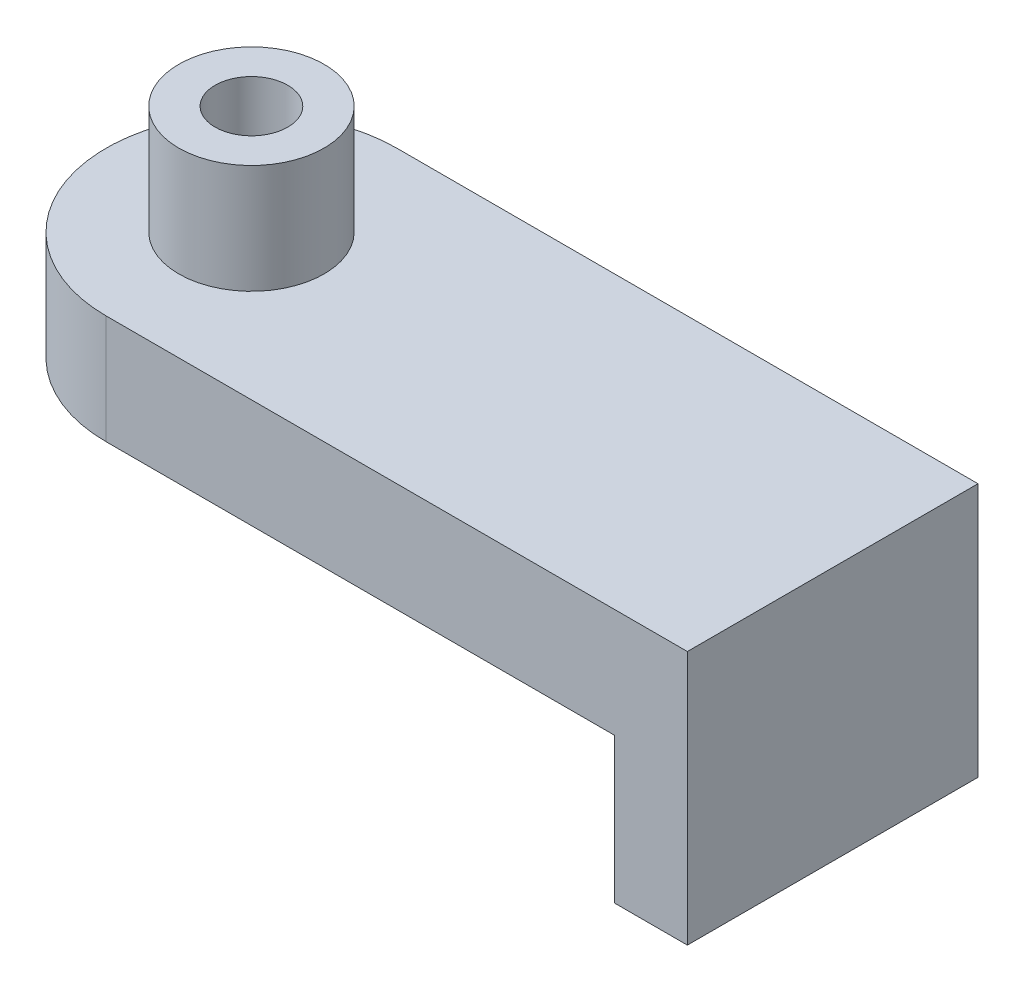
ISO-10303-21;
HEADER;
FILE_DESCRIPTION(('STEP AP214'),'2;1');
FILE_NAME('part.step','',(''),(''),'','','');
FILE_SCHEMA(('AUTOMOTIVE_DESIGN { 1 0 10303 214 1 1 1 1 }'));
ENDSEC;
DATA;
#1=APPLICATION_CONTEXT('core data for automotive mechanical design processes');
#2=APPLICATION_PROTOCOL_DEFINITION('international standard','automotive_design',2000,#1);
#3=PRODUCT_CONTEXT('',#1,'mechanical');
#4=PRODUCT('Part','Part','',(#3));
#5=PRODUCT_RELATED_PRODUCT_CATEGORY('part','',(#4));
#6=PRODUCT_DEFINITION_FORMATION('','',#4);
#7=PRODUCT_DEFINITION_CONTEXT('part definition',#1,'design');
#8=PRODUCT_DEFINITION('design','',#6,#7);
#9=PRODUCT_DEFINITION_SHAPE('','',#8);
#10=(LENGTH_UNIT() NAMED_UNIT(*) SI_UNIT(.MILLI.,.METRE.));
#11=(NAMED_UNIT(*) PLANE_ANGLE_UNIT() SI_UNIT($,.RADIAN.));
#12=(NAMED_UNIT(*) SI_UNIT($,.STERADIAN.) SOLID_ANGLE_UNIT());
#13=UNCERTAINTY_MEASURE_WITH_UNIT(LENGTH_MEASURE(1.E-05),#10,'distance_accuracy_value','');
#14=(GEOMETRIC_REPRESENTATION_CONTEXT(3) GLOBAL_UNCERTAINTY_ASSIGNED_CONTEXT((#13)) GLOBAL_UNIT_ASSIGNED_CONTEXT((#10,
#11,#12)) REPRESENTATION_CONTEXT('',''));
#15=CARTESIAN_POINT('',(0.,0.,0.));
#16=DIRECTION('',(0.,0.,1.));
#17=DIRECTION('',(1.,0.,0.));
#18=AXIS2_PLACEMENT_3D('',#15,#16,#17);
#19=CARTESIAN_POINT('',(0.,0.,-20.));
#20=DIRECTION('',(0.,1.,0.));
#21=DIRECTION('',(0.,0.,1.));
#22=AXIS2_PLACEMENT_3D('',#19,#20,#21);
#23=PLANE('',#22);
#24=CARTESIAN_POINT('',(0.,0.,-20.));
#25=DIRECTION('',(0.,1.,0.));
#26=DIRECTION('',(0.,0.,1.));
#27=AXIS2_PLACEMENT_3D('',#24,#25,#26);
#28=CIRCLE('',#27,5.);
#29=CARTESIAN_POINT('',(0.,0.,-15.));
#30=VERTEX_POINT('',#29);
#31=EDGE_CURVE('E144',#30,#30,#28,.T.);
#32=ORIENTED_EDGE('',*,*,#31,.T.);
#33=EDGE_LOOP('',(#32));
#34=FACE_BOUND('',#33,.T.);
#35=DIRECTION('',(0.,0.,-1.));
#36=VECTOR('',#35,1.);
#37=CARTESIAN_POINT('',(70.,0.,0.));
#38=LINE('',#37,#36);
#39=CARTESIAN_POINT('',(70.,0.,0.));
#40=VERTEX_POINT('',#39);
#41=CARTESIAN_POINT('',(70.,0.,-40.));
#42=VERTEX_POINT('',#41);
#43=EDGE_CURVE('E49',#40,#42,#38,.T.);
#44=ORIENTED_EDGE('',*,*,#43,.F.);
#45=DIRECTION('',(1.,0.,0.));
#46=VECTOR('',#45,1.);
#47=CARTESIAN_POINT('',(0.,0.,0.));
#48=LINE('',#47,#46);
#49=CARTESIAN_POINT('',(0.,0.,0.));
#50=VERTEX_POINT('',#49);
#51=EDGE_CURVE('E128',#50,#40,#48,.T.);
#52=ORIENTED_EDGE('',*,*,#51,.F.);
#53=CARTESIAN_POINT('',(0.,0.,-20.));
#54=DIRECTION('',(0.,1.,0.));
#55=DIRECTION('',(0.,0.,1.));
#56=AXIS2_PLACEMENT_3D('',#53,#54,#55);
#57=CIRCLE('',#56,20.);
#58=CARTESIAN_POINT('',(0.,0.,-40.));
#59=VERTEX_POINT('',#58);
#60=EDGE_CURVE('E148',#59,#50,#57,.T.);
#61=ORIENTED_EDGE('',*,*,#60,.F.);
#62=DIRECTION('',(-1.,0.,0.));
#63=VECTOR('',#62,1.);
#64=CARTESIAN_POINT('',(0.,0.,-40.));
#65=LINE('',#64,#63);
#66=EDGE_CURVE('E71',#42,#59,#65,.T.);
#67=ORIENTED_EDGE('',*,*,#66,.F.);
#68=EDGE_LOOP('',(#44,#52,#61,#67));
#69=FACE_BOUND('',#68,.T.);
#70=ADVANCED_FACE('F32',(#34,#69),#23,.F.);
#71=CARTESIAN_POINT('',(0.,15.,-20.));
#72=DIRECTION('',(0.,1.,0.));
#73=DIRECTION('',(0.,0.,1.));
#74=AXIS2_PLACEMENT_3D('',#71,#72,#73);
#75=PLANE('',#74);
#76=CARTESIAN_POINT('',(0.,15.,-20.));
#77=DIRECTION('',(0.,1.,0.));
#78=DIRECTION('',(0.,0.,1.));
#79=AXIS2_PLACEMENT_3D('',#76,#77,#78);
#80=CIRCLE('',#79,20.);
#81=CARTESIAN_POINT('',(0.,15.,-40.));
#82=VERTEX_POINT('',#81);
#83=CARTESIAN_POINT('',(0.,15.,0.));
#84=VERTEX_POINT('',#83);
#85=EDGE_CURVE('E149',#82,#84,#80,.T.);
#86=ORIENTED_EDGE('',*,*,#85,.T.);
#87=DIRECTION('',(1.,0.,0.));
#88=VECTOR('',#87,1.);
#89=CARTESIAN_POINT('',(0.,15.,0.));
#90=LINE('',#89,#88);
#91=CARTESIAN_POINT('',(80.,15.,0.));
#92=VERTEX_POINT('',#91);
#93=EDGE_CURVE('E78',#84,#92,#90,.T.);
#94=ORIENTED_EDGE('',*,*,#93,.T.);
#95=DIRECTION('',(0.,0.,-1.));
#96=VECTOR('',#95,1.);
#97=CARTESIAN_POINT('',(80.,15.,0.));
#98=LINE('',#97,#96);
#99=CARTESIAN_POINT('',(80.,15.,-40.));
#100=VERTEX_POINT('',#99);
#101=EDGE_CURVE('E100',#92,#100,#98,.T.);
#102=ORIENTED_EDGE('',*,*,#101,.T.);
#103=DIRECTION('',(-1.,0.,0.));
#104=VECTOR('',#103,1.);
#105=CARTESIAN_POINT('',(0.,15.,-40.));
#106=LINE('',#105,#104);
#107=EDGE_CURVE('E58',#100,#82,#106,.T.);
#108=ORIENTED_EDGE('',*,*,#107,.T.);
#109=EDGE_LOOP('',(#86,#94,#102,#108));
#110=FACE_BOUND('',#109,.T.);
#111=CARTESIAN_POINT('',(0.,15.,-20.));
#112=DIRECTION('',(0.,1.,0.));
#113=DIRECTION('',(0.,0.,1.));
#114=AXIS2_PLACEMENT_3D('',#111,#112,#113);
#115=CIRCLE('',#114,10.);
#116=CARTESIAN_POINT('',(0.,15.,-10.));
#117=VERTEX_POINT('',#116);
#118=EDGE_CURVE('E135',#117,#117,#115,.T.);
#119=ORIENTED_EDGE('',*,*,#118,.F.);
#120=EDGE_LOOP('',(#119));
#121=FACE_BOUND('',#120,.T.);
#122=ADVANCED_FACE('F181',(#110,#121),#75,.T.);
#123=CARTESIAN_POINT('',(0.,15.,-20.));
#124=DIRECTION('',(0.,-1.,0.));
#125=DIRECTION('',(0.,0.,-1.));
#126=AXIS2_PLACEMENT_3D('',#123,#124,#125);
#127=CYLINDRICAL_SURFACE('',#126,20.);
#128=ORIENTED_EDGE('',*,*,#60,.T.);
#129=DIRECTION('',(0.,-1.,0.));
#130=VECTOR('',#129,1.);
#131=CARTESIAN_POINT('',(0.,15.,0.));
#132=LINE('',#131,#130);
#133=EDGE_CURVE('E11',#84,#50,#132,.T.);
#134=ORIENTED_EDGE('',*,*,#133,.F.);
#135=ORIENTED_EDGE('',*,*,#85,.F.);
#136=DIRECTION('',(0.,-1.,0.));
#137=VECTOR('',#136,1.);
#138=CARTESIAN_POINT('',(0.,15.,-40.));
#139=LINE('',#138,#137);
#140=EDGE_CURVE('E154',#82,#59,#139,.T.);
#141=ORIENTED_EDGE('',*,*,#140,.T.);
#142=EDGE_LOOP('',(#128,#134,#135,#141));
#143=FACE_BOUND('',#142,.T.);
#144=ADVANCED_FACE('F34',(#143),#127,.T.);
#145=CARTESIAN_POINT('',(0.,15.,0.));
#146=DIRECTION('',(0.,0.,-1.));
#147=DIRECTION('',(-1.,0.,0.));
#148=AXIS2_PLACEMENT_3D('',#145,#146,#147);
#149=PLANE('',#148);
#150=ORIENTED_EDGE('',*,*,#51,.T.);
#151=DIRECTION('',(0.,1.,0.));
#152=VECTOR('',#151,1.);
#153=CARTESIAN_POINT('',(70.,-20.,0.));
#154=LINE('',#153,#152);
#155=CARTESIAN_POINT('',(70.,-20.,0.));
#156=VERTEX_POINT('',#155);
#157=EDGE_CURVE('E107',#156,#40,#154,.T.);
#158=ORIENTED_EDGE('',*,*,#157,.F.);
#159=DIRECTION('',(-1.,0.,0.));
#160=VECTOR('',#159,1.);
#161=CARTESIAN_POINT('',(80.,-20.,0.));
#162=LINE('',#161,#160);
#163=CARTESIAN_POINT('',(80.,-20.,0.));
#164=VERTEX_POINT('',#163);
#165=EDGE_CURVE('E104',#164,#156,#162,.T.);
#166=ORIENTED_EDGE('',*,*,#165,.F.);
#167=DIRECTION('',(0.,-1.,0.));
#168=VECTOR('',#167,1.);
#169=CARTESIAN_POINT('',(80.,15.,0.));
#170=LINE('',#169,#168);
#171=EDGE_CURVE('E41',#92,#164,#170,.T.);
#172=ORIENTED_EDGE('',*,*,#171,.F.);
#173=ORIENTED_EDGE('',*,*,#93,.F.);
#174=ORIENTED_EDGE('',*,*,#133,.T.);
#175=EDGE_LOOP('',(#150,#158,#166,#172,#173,#174));
#176=FACE_BOUND('',#175,.T.);
#177=ADVANCED_FACE('F105',(#176),#149,.F.);
#178=CARTESIAN_POINT('',(80.,15.,0.));
#179=DIRECTION('',(-1.,0.,0.));
#180=DIRECTION('',(0.,0.,1.));
#181=AXIS2_PLACEMENT_3D('',#178,#179,#180);
#182=PLANE('',#181);
#183=ORIENTED_EDGE('',*,*,#171,.T.);
#184=DIRECTION('',(0.,0.,1.));
#185=VECTOR('',#184,1.);
#186=CARTESIAN_POINT('',(80.,-20.,0.));
#187=LINE('',#186,#185);
#188=CARTESIAN_POINT('',(80.,-20.,-40.));
#189=VERTEX_POINT('',#188);
#190=EDGE_CURVE('E99',#189,#164,#187,.T.);
#191=ORIENTED_EDGE('',*,*,#190,.F.);
#192=DIRECTION('',(0.,-1.,0.));
#193=VECTOR('',#192,1.);
#194=CARTESIAN_POINT('',(80.,15.,-40.));
#195=LINE('',#194,#193);
#196=EDGE_CURVE('E101',#100,#189,#195,.T.);
#197=ORIENTED_EDGE('',*,*,#196,.F.);
#198=ORIENTED_EDGE('',*,*,#101,.F.);
#199=EDGE_LOOP('',(#183,#191,#197,#198));
#200=FACE_BOUND('',#199,.T.);
#201=ADVANCED_FACE('F96',(#200),#182,.F.);
#202=CARTESIAN_POINT('',(0.,15.,-40.));
#203=DIRECTION('',(0.,0.,1.));
#204=DIRECTION('',(1.,0.,0.));
#205=AXIS2_PLACEMENT_3D('',#202,#203,#204);
#206=PLANE('',#205);
#207=ORIENTED_EDGE('',*,*,#196,.T.);
#208=DIRECTION('',(1.,0.,0.));
#209=VECTOR('',#208,1.);
#210=CARTESIAN_POINT('',(80.,-20.,-40.));
#211=LINE('',#210,#209);
#212=CARTESIAN_POINT('',(70.,-20.,-40.));
#213=VERTEX_POINT('',#212);
#214=EDGE_CURVE('E115',#213,#189,#211,.T.);
#215=ORIENTED_EDGE('',*,*,#214,.F.);
#216=DIRECTION('',(0.,1.,0.));
#217=VECTOR('',#216,1.);
#218=CARTESIAN_POINT('',(70.,-20.,-40.));
#219=LINE('',#218,#217);
#220=EDGE_CURVE('E121',#213,#42,#219,.T.);
#221=ORIENTED_EDGE('',*,*,#220,.T.);
#222=ORIENTED_EDGE('',*,*,#66,.T.);
#223=ORIENTED_EDGE('',*,*,#140,.F.);
#224=ORIENTED_EDGE('',*,*,#107,.F.);
#225=EDGE_LOOP('',(#207,#215,#221,#222,#223,#224));
#226=FACE_BOUND('',#225,.T.);
#227=ADVANCED_FACE('F167',(#226),#206,.F.);
#228=CARTESIAN_POINT('',(0.,15.,-20.));
#229=DIRECTION('',(0.,-1.,0.));
#230=DIRECTION('',(0.,0.,-1.));
#231=AXIS2_PLACEMENT_3D('',#228,#229,#230);
#232=CYLINDRICAL_SURFACE('',#231,5.);
#233=ORIENTED_EDGE('',*,*,#31,.F.);
#234=EDGE_LOOP('',(#233));
#235=FACE_BOUND('',#234,.T.);
#236=CARTESIAN_POINT('',(0.,30.,-20.));
#237=DIRECTION('',(0.,1.,0.));
#238=DIRECTION('',(0.,0.,1.));
#239=AXIS2_PLACEMENT_3D('',#236,#237,#238);
#240=CIRCLE('',#239,5.);
#241=CARTESIAN_POINT('',(0.,30.,-15.));
#242=VERTEX_POINT('',#241);
#243=EDGE_CURVE('E124',#242,#242,#240,.T.);
#244=ORIENTED_EDGE('',*,*,#243,.T.);
#245=EDGE_LOOP('',(#244));
#246=FACE_BOUND('',#245,.T.);
#247=ADVANCED_FACE('F169',(#235,#246),#232,.F.);
#248=CARTESIAN_POINT('',(0.,30.,-20.));
#249=DIRECTION('',(0.,1.,0.));
#250=DIRECTION('',(0.,0.,1.));
#251=AXIS2_PLACEMENT_3D('',#248,#249,#250);
#252=PLANE('',#251);
#253=CARTESIAN_POINT('',(0.,30.,-20.));
#254=DIRECTION('',(0.,1.,0.));
#255=DIRECTION('',(0.,0.,1.));
#256=AXIS2_PLACEMENT_3D('',#253,#254,#255);
#257=CIRCLE('',#256,10.);
#258=CARTESIAN_POINT('',(0.,30.,-10.));
#259=VERTEX_POINT('',#258);
#260=EDGE_CURVE('E139',#259,#259,#257,.T.);
#261=ORIENTED_EDGE('',*,*,#260,.T.);
#262=EDGE_LOOP('',(#261));
#263=FACE_BOUND('',#262,.T.);
#264=ORIENTED_EDGE('',*,*,#243,.F.);
#265=EDGE_LOOP('',(#264));
#266=FACE_BOUND('',#265,.T.);
#267=ADVANCED_FACE('F175',(#263,#266),#252,.T.);
#268=CARTESIAN_POINT('',(0.,30.,-20.));
#269=DIRECTION('',(0.,-1.,0.));
#270=DIRECTION('',(0.,0.,-1.));
#271=AXIS2_PLACEMENT_3D('',#268,#269,#270);
#272=CYLINDRICAL_SURFACE('',#271,10.);
#273=ORIENTED_EDGE('',*,*,#260,.F.);
#274=EDGE_LOOP('',(#273));
#275=FACE_BOUND('',#274,.T.);
#276=ORIENTED_EDGE('',*,*,#118,.T.);
#277=EDGE_LOOP('',(#276));
#278=FACE_BOUND('',#277,.T.);
#279=ADVANCED_FACE('F188',(#275,#278),#272,.T.);
#280=CARTESIAN_POINT('',(70.,-20.,0.));
#281=DIRECTION('',(1.,0.,0.));
#282=DIRECTION('',(0.,0.,-1.));
#283=AXIS2_PLACEMENT_3D('',#280,#281,#282);
#284=PLANE('',#283);
#285=ORIENTED_EDGE('',*,*,#43,.T.);
#286=ORIENTED_EDGE('',*,*,#220,.F.);
#287=DIRECTION('',(0.,0.,-1.));
#288=VECTOR('',#287,1.);
#289=CARTESIAN_POINT('',(70.,-20.,0.));
#290=LINE('',#289,#288);
#291=EDGE_CURVE('E110',#156,#213,#290,.T.);
#292=ORIENTED_EDGE('',*,*,#291,.F.);
#293=ORIENTED_EDGE('',*,*,#157,.T.);
#294=EDGE_LOOP('',(#285,#286,#292,#293));
#295=FACE_BOUND('',#294,.T.);
#296=ADVANCED_FACE('F166',(#295),#284,.F.);
#297=CARTESIAN_POINT('',(0.,-20.,0.));
#298=DIRECTION('',(0.,1.,0.));
#299=DIRECTION('',(0.,0.,1.));
#300=AXIS2_PLACEMENT_3D('',#297,#298,#299);
#301=PLANE('',#300);
#302=ORIENTED_EDGE('',*,*,#190,.T.);
#303=ORIENTED_EDGE('',*,*,#165,.T.);
#304=ORIENTED_EDGE('',*,*,#291,.T.);
#305=ORIENTED_EDGE('',*,*,#214,.T.);
#306=EDGE_LOOP('',(#302,#303,#304,#305));
#307=FACE_BOUND('',#306,.T.);
#308=ADVANCED_FACE('F113',(#307),#301,.F.);
#309=CLOSED_SHELL('',(#70,#122,#144,#177,#201,#227,#247,#267,#279,#296,#308));
#310=MANIFOLD_SOLID_BREP('B2',#309);
#311=ADVANCED_BREP_SHAPE_REPRESENTATION('',(#18,#310),#14);
#312=SHAPE_DEFINITION_REPRESENTATION(#9,#311);
ENDSEC;
END-ISO-10303-21;
